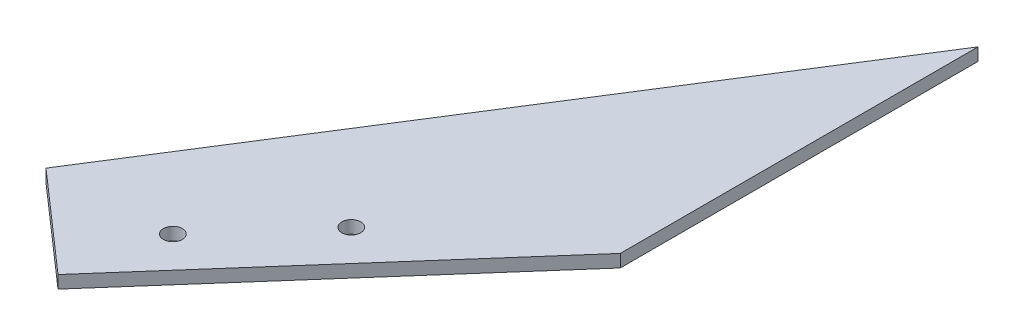
ISO-10303-21;
HEADER;
FILE_DESCRIPTION(('STEP AP214'),'2;1');
FILE_NAME('part.step','',(''),(''),'','','');
FILE_SCHEMA(('AUTOMOTIVE_DESIGN { 1 0 10303 214 1 1 1 1 }'));
ENDSEC;
DATA;
#1=APPLICATION_CONTEXT('core data for automotive mechanical design processes');
#2=APPLICATION_PROTOCOL_DEFINITION('international standard','automotive_design',2000,#1);
#3=PRODUCT_CONTEXT('',#1,'mechanical');
#4=PRODUCT('Part','Part','',(#3));
#5=PRODUCT_RELATED_PRODUCT_CATEGORY('part','',(#4));
#6=PRODUCT_DEFINITION_FORMATION('','',#4);
#7=PRODUCT_DEFINITION_CONTEXT('part definition',#1,'design');
#8=PRODUCT_DEFINITION('design','',#6,#7);
#9=PRODUCT_DEFINITION_SHAPE('','',#8);
#10=(LENGTH_UNIT() NAMED_UNIT(*) SI_UNIT(.MILLI.,.METRE.));
#11=(NAMED_UNIT(*) PLANE_ANGLE_UNIT() SI_UNIT($,.RADIAN.));
#12=(NAMED_UNIT(*) SI_UNIT($,.STERADIAN.) SOLID_ANGLE_UNIT());
#13=UNCERTAINTY_MEASURE_WITH_UNIT(LENGTH_MEASURE(1.E-05),#10,'distance_accuracy_value','');
#14=(GEOMETRIC_REPRESENTATION_CONTEXT(3) GLOBAL_UNCERTAINTY_ASSIGNED_CONTEXT((#13)) GLOBAL_UNIT_ASSIGNED_CONTEXT((#10,
#11,#12)) REPRESENTATION_CONTEXT('',''));
#15=CARTESIAN_POINT('',(0.,0.,0.));
#16=DIRECTION('',(0.,0.,1.));
#17=DIRECTION('',(1.,0.,0.));
#18=AXIS2_PLACEMENT_3D('',#15,#16,#17);
#19=CARTESIAN_POINT('',(1375.432860995,-1700.1,1854.394310484));
#20=DIRECTION('',(0.,-1.,0.));
#21=DIRECTION('',(0.965925826288944,0.,-0.258819045102985));
#22=AXIS2_PLACEMENT_3D('',#19,#20,#21);
#23=CYLINDRICAL_SURFACE('',#22,4.5);
#24=CARTESIAN_POINT('',(1375.432860995,-1696.,1854.394310484));
#25=DIRECTION('',(0.,-1.,0.));
#26=DIRECTION('',(0.965925826288944,0.,-0.258819045102985));
#27=AXIS2_PLACEMENT_3D('',#24,#25,#26);
#28=CIRCLE('',#27,4.5);
#29=CARTESIAN_POINT('',(1379.779527214,-1696.,1853.229624781));
#30=VERTEX_POINT('',#29);
#31=EDGE_CURVE('E133',#30,#30,#28,.T.);
#32=ORIENTED_EDGE('',*,*,#31,.T.);
#33=DIRECTION('',(0.,1.,0.));
#34=VECTOR('',#33,1.);
#35=CARTESIAN_POINT('',(1379.779527214,-1700.1,1853.229624781));
#36=LINE('',#35,#34);
#37=CARTESIAN_POINT('',(1379.779527214,-1690.,1853.229624781));
#38=VERTEX_POINT('',#37);
#39=EDGE_CURVE('E11',#30,#38,#36,.T.);
#40=ORIENTED_EDGE('',*,*,#39,.T.);
#41=CARTESIAN_POINT('',(1375.432860995,-1690.,1854.394310484));
#42=DIRECTION('',(0.,-1.,0.));
#43=DIRECTION('',(0.965925826288944,0.,-0.258819045102985));
#44=AXIS2_PLACEMENT_3D('',#41,#42,#43);
#45=CIRCLE('',#44,4.5);
#46=EDGE_CURVE('E125',#38,#38,#45,.T.);
#47=ORIENTED_EDGE('',*,*,#46,.F.);
#48=ORIENTED_EDGE('',*,*,#39,.F.);
#49=EDGE_LOOP('',(#32,#40,#47,#48));
#50=FACE_BOUND('',#49,.T.);
#51=ADVANCED_FACE('F17',(#50),#23,.F.);
#52=CARTESIAN_POINT('',(1335.854384718,-1700.1,1899.489146282));
#53=DIRECTION('',(0.,-1.,0.));
#54=DIRECTION('',(0.965925826288944,0.,-0.258819045102985));
#55=AXIS2_PLACEMENT_3D('',#52,#53,#54);
#56=CYLINDRICAL_SURFACE('',#55,4.5);
#57=CARTESIAN_POINT('',(1335.854384718,-1696.,1899.489146282));
#58=DIRECTION('',(0.,-1.,0.));
#59=DIRECTION('',(0.965925826288944,0.,-0.258819045102985));
#60=AXIS2_PLACEMENT_3D('',#57,#58,#59);
#61=CIRCLE('',#60,4.5);
#62=CARTESIAN_POINT('',(1340.201050937,-1696.,1898.324460579));
#63=VERTEX_POINT('',#62);
#64=EDGE_CURVE('E95',#63,#63,#61,.T.);
#65=ORIENTED_EDGE('',*,*,#64,.T.);
#66=DIRECTION('',(0.,1.,0.));
#67=VECTOR('',#66,1.);
#68=CARTESIAN_POINT('',(1340.201050937,-1700.1,1898.324460579));
#69=LINE('',#68,#67);
#70=CARTESIAN_POINT('',(1340.201050937,-1690.,1898.324460579));
#71=VERTEX_POINT('',#70);
#72=EDGE_CURVE('E25',#63,#71,#69,.T.);
#73=ORIENTED_EDGE('',*,*,#72,.T.);
#74=CARTESIAN_POINT('',(1335.854384718,-1690.,1899.489146282));
#75=DIRECTION('',(0.,-1.,0.));
#76=DIRECTION('',(0.965925826288944,0.,-0.258819045102985));
#77=AXIS2_PLACEMENT_3D('',#74,#75,#76);
#78=CIRCLE('',#77,4.5);
#79=EDGE_CURVE('E130',#71,#71,#78,.T.);
#80=ORIENTED_EDGE('',*,*,#79,.F.);
#81=ORIENTED_EDGE('',*,*,#72,.F.);
#82=EDGE_LOOP('',(#65,#73,#80,#81));
#83=FACE_BOUND('',#82,.T.);
#84=ADVANCED_FACE('F140',(#83),#56,.F.);
#85=CARTESIAN_POINT('',(1278.653929406,-1696.,1902.507078024));
#86=DIRECTION('',(-0.845247581228826,0.,-0.53437489314789));
#87=DIRECTION('',(-0.53437489314789,0.,0.845247581228826));
#88=AXIS2_PLACEMENT_3D('',#85,#86,#87);
#89=PLANE('',#88);
#90=DIRECTION('',(0.,1.,0.));
#91=VECTOR('',#90,1.);
#92=CARTESIAN_POINT('',(1278.653929406,-1696.,1902.507078024));
#93=LINE('',#92,#91);
#94=CARTESIAN_POINT('',(1278.653929406,-1696.,1902.507078024));
#95=VERTEX_POINT('',#94);
#96=CARTESIAN_POINT('',(1278.653929406,-1690.,1902.507078024));
#97=VERTEX_POINT('',#96);
#98=EDGE_CURVE('E129',#95,#97,#93,.T.);
#99=ORIENTED_EDGE('',*,*,#98,.T.);
#100=DIRECTION('',(0.53437489314789,0.,-0.845247581228826));
#101=VECTOR('',#100,1.);
#102=CARTESIAN_POINT('',(1278.653929406,-1690.,1902.507078024));
#103=LINE('',#102,#101);
#104=CARTESIAN_POINT('',(1450.,-1690.,1631.480400723));
#105=VERTEX_POINT('',#104);
#106=EDGE_CURVE('E105',#97,#105,#103,.T.);
#107=ORIENTED_EDGE('',*,*,#106,.T.);
#108=DIRECTION('',(0.,1.,0.));
#109=VECTOR('',#108,1.);
#110=CARTESIAN_POINT('',(1450.,-1696.,1631.480400723));
#111=LINE('',#110,#109);
#112=CARTESIAN_POINT('',(1450.,-1696.,1631.480400723));
#113=VERTEX_POINT('',#112);
#114=EDGE_CURVE('E101',#113,#105,#111,.T.);
#115=ORIENTED_EDGE('',*,*,#114,.F.);
#116=DIRECTION('',(0.53437489314789,0.,-0.845247581228826));
#117=VECTOR('',#116,1.);
#118=CARTESIAN_POINT('',(1278.653929406,-1696.,1902.507078024));
#119=LINE('',#118,#117);
#120=EDGE_CURVE('E84',#95,#113,#119,.T.);
#121=ORIENTED_EDGE('',*,*,#120,.F.);
#122=EDGE_LOOP('',(#99,#107,#115,#121));
#123=FACE_BOUND('',#122,.T.);
#124=ADVANCED_FACE('F108',(#123),#89,.T.);
#125=CARTESIAN_POINT('',(1384.669923806,-1696.,1795.308928422));
#126=DIRECTION('',(0.,-1.,0.));
#127=DIRECTION('',(0.,0.,-1.));
#128=AXIS2_PLACEMENT_3D('',#125,#126,#127);
#129=PLANE('',#128);
#130=ORIENTED_EDGE('',*,*,#31,.F.);
#131=EDGE_LOOP('',(#130));
#132=FACE_BOUND('',#131,.T.);
#133=ORIENTED_EDGE('',*,*,#64,.F.);
#134=EDGE_LOOP('',(#133));
#135=FACE_BOUND('',#134,.T.);
#136=DIRECTION('',(-0.659641271282423,0.,0.751580596623482));
#137=VECTOR('',#136,1.);
#138=CARTESIAN_POINT('',(1450.,-1696.,1801.269655695));
#139=LINE('',#138,#137);
#140=CARTESIAN_POINT('',(1450.,-1696.,1801.269655695));
#141=VERTEX_POINT('',#140);
#142=CARTESIAN_POINT('',(1325.251926396,-1696.,1943.404836844));
#143=VERTEX_POINT('',#142);
#144=EDGE_CURVE('E112',#141,#143,#139,.T.);
#145=ORIENTED_EDGE('',*,*,#144,.T.);
#146=DIRECTION('',(-0.751580596623482,0.,-0.659641271282423));
#147=VECTOR('',#146,1.);
#148=CARTESIAN_POINT('',(1325.251926396,-1696.,1943.404836844));
#149=LINE('',#148,#147);
#150=EDGE_CURVE('E90',#143,#95,#149,.T.);
#151=ORIENTED_EDGE('',*,*,#150,.T.);
#152=ORIENTED_EDGE('',*,*,#120,.T.);
#153=DIRECTION('',(0.,0.,1.));
#154=VECTOR('',#153,1.);
#155=CARTESIAN_POINT('',(1450.,-1696.,1631.480400723));
#156=LINE('',#155,#154);
#157=EDGE_CURVE('E88',#113,#141,#156,.T.);
#158=ORIENTED_EDGE('',*,*,#157,.T.);
#159=EDGE_LOOP('',(#145,#151,#152,#158));
#160=FACE_BOUND('',#159,.T.);
#161=ADVANCED_FACE('F87',(#132,#135,#160),#129,.T.);
#162=CARTESIAN_POINT('',(1325.251926396,-1696.,1943.404836844));
#163=DIRECTION('',(-0.659641271282423,0.,0.751580596623482));
#164=DIRECTION('',(0.,1.,0.));
#165=AXIS2_PLACEMENT_3D('',#162,#163,#164);
#166=PLANE('',#165);
#167=DIRECTION('',(0.,1.,0.));
#168=VECTOR('',#167,1.);
#169=CARTESIAN_POINT('',(1325.251926396,-1696.,1943.404836844));
#170=LINE('',#169,#168);
#171=CARTESIAN_POINT('',(1325.251926396,-1690.,1943.404836844));
#172=VERTEX_POINT('',#171);
#173=EDGE_CURVE('E118',#143,#172,#170,.T.);
#174=ORIENTED_EDGE('',*,*,#173,.T.);
#175=DIRECTION('',(-0.751580596623482,0.,-0.659641271282423));
#176=VECTOR('',#175,1.);
#177=CARTESIAN_POINT('',(1325.251926396,-1690.,1943.404836844));
#178=LINE('',#177,#176);
#179=EDGE_CURVE('E124',#172,#97,#178,.T.);
#180=ORIENTED_EDGE('',*,*,#179,.T.);
#181=ORIENTED_EDGE('',*,*,#98,.F.);
#182=ORIENTED_EDGE('',*,*,#150,.F.);
#183=EDGE_LOOP('',(#174,#180,#181,#182));
#184=FACE_BOUND('',#183,.T.);
#185=ADVANCED_FACE('F167',(#184),#166,.T.);
#186=CARTESIAN_POINT('',(1384.669923806,-1690.,1795.308928422));
#187=DIRECTION('',(0.,-1.,0.));
#188=DIRECTION('',(0.,0.,-1.));
#189=AXIS2_PLACEMENT_3D('',#186,#187,#188);
#190=PLANE('',#189);
#191=ORIENTED_EDGE('',*,*,#46,.T.);
#192=EDGE_LOOP('',(#191));
#193=FACE_BOUND('',#192,.T.);
#194=ORIENTED_EDGE('',*,*,#79,.T.);
#195=EDGE_LOOP('',(#194));
#196=FACE_BOUND('',#195,.T.);
#197=DIRECTION('',(0.,0.,1.));
#198=VECTOR('',#197,1.);
#199=CARTESIAN_POINT('',(1450.,-1690.,1631.480400723));
#200=LINE('',#199,#198);
#201=CARTESIAN_POINT('',(1450.,-1690.,1801.269655695));
#202=VERTEX_POINT('',#201);
#203=EDGE_CURVE('E106',#105,#202,#200,.T.);
#204=ORIENTED_EDGE('',*,*,#203,.F.);
#205=ORIENTED_EDGE('',*,*,#106,.F.);
#206=ORIENTED_EDGE('',*,*,#179,.F.);
#207=DIRECTION('',(-0.659641271282423,0.,0.751580596623482));
#208=VECTOR('',#207,1.);
#209=CARTESIAN_POINT('',(1450.,-1690.,1801.269655695));
#210=LINE('',#209,#208);
#211=EDGE_CURVE('E156',#202,#172,#210,.T.);
#212=ORIENTED_EDGE('',*,*,#211,.F.);
#213=EDGE_LOOP('',(#204,#205,#206,#212));
#214=FACE_BOUND('',#213,.T.);
#215=ADVANCED_FACE('F143',(#193,#196,#214),#190,.F.);
#216=CARTESIAN_POINT('',(1450.,-1696.,1631.480400723));
#217=DIRECTION('',(1.,0.,0.));
#218=DIRECTION('',(0.,0.,1.));
#219=AXIS2_PLACEMENT_3D('',#216,#217,#218);
#220=PLANE('',#219);
#221=ORIENTED_EDGE('',*,*,#114,.T.);
#222=ORIENTED_EDGE('',*,*,#203,.T.);
#223=DIRECTION('',(0.,1.,0.));
#224=VECTOR('',#223,1.);
#225=CARTESIAN_POINT('',(1450.,-1696.,1801.269655695));
#226=LINE('',#225,#224);
#227=EDGE_CURVE('E103',#141,#202,#226,.T.);
#228=ORIENTED_EDGE('',*,*,#227,.F.);
#229=ORIENTED_EDGE('',*,*,#157,.F.);
#230=EDGE_LOOP('',(#221,#222,#228,#229));
#231=FACE_BOUND('',#230,.T.);
#232=ADVANCED_FACE('F100',(#231),#220,.T.);
#233=CARTESIAN_POINT('',(1450.,-1696.,1801.269655695));
#234=DIRECTION('',(0.751580596623482,0.,0.659641271282423));
#235=DIRECTION('',(0.,-1.,0.));
#236=AXIS2_PLACEMENT_3D('',#233,#234,#235);
#237=PLANE('',#236);
#238=ORIENTED_EDGE('',*,*,#227,.T.);
#239=ORIENTED_EDGE('',*,*,#211,.T.);
#240=ORIENTED_EDGE('',*,*,#173,.F.);
#241=ORIENTED_EDGE('',*,*,#144,.F.);
#242=EDGE_LOOP('',(#238,#239,#240,#241));
#243=FACE_BOUND('',#242,.T.);
#244=ADVANCED_FACE('F165',(#243),#237,.T.);
#245=CLOSED_SHELL('',(#51,#84,#124,#161,#185,#215,#232,#244));
#246=MANIFOLD_SOLID_BREP('B1',#245);
#247=ADVANCED_BREP_SHAPE_REPRESENTATION('',(#18,#246),#14);
#248=SHAPE_DEFINITION_REPRESENTATION(#9,#247);
ENDSEC;
END-ISO-10303-21;
